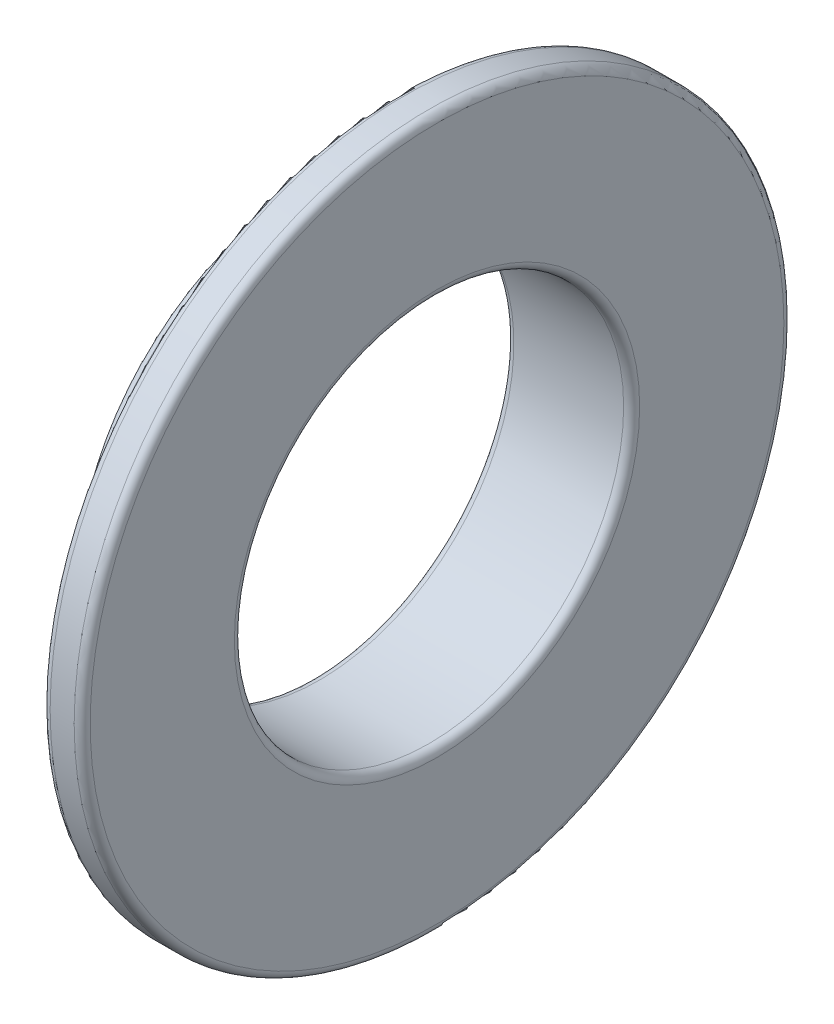
ISO-10303-21;
HEADER;
FILE_DESCRIPTION(('STEP AP214'),'2;1');
FILE_NAME('part.step','',(''),(''),'','','');
FILE_SCHEMA(('AUTOMOTIVE_DESIGN { 1 0 10303 214 1 1 1 1 }'));
ENDSEC;
DATA;
#1=APPLICATION_CONTEXT('core data for automotive mechanical design processes');
#2=APPLICATION_PROTOCOL_DEFINITION('international standard','automotive_design',2000,#1);
#3=PRODUCT_CONTEXT('',#1,'mechanical');
#4=PRODUCT('Part','Part','',(#3));
#5=PRODUCT_RELATED_PRODUCT_CATEGORY('part','',(#4));
#6=PRODUCT_DEFINITION_FORMATION('','',#4);
#7=PRODUCT_DEFINITION_CONTEXT('part definition',#1,'design');
#8=PRODUCT_DEFINITION('design','',#6,#7);
#9=PRODUCT_DEFINITION_SHAPE('','',#8);
#10=(LENGTH_UNIT() NAMED_UNIT(*) SI_UNIT(.MILLI.,.METRE.));
#11=(NAMED_UNIT(*) PLANE_ANGLE_UNIT() SI_UNIT($,.RADIAN.));
#12=(NAMED_UNIT(*) SI_UNIT($,.STERADIAN.) SOLID_ANGLE_UNIT());
#13=UNCERTAINTY_MEASURE_WITH_UNIT(LENGTH_MEASURE(1.E-05),#10,'distance_accuracy_value','');
#14=(GEOMETRIC_REPRESENTATION_CONTEXT(3) GLOBAL_UNCERTAINTY_ASSIGNED_CONTEXT((#13)) GLOBAL_UNIT_ASSIGNED_CONTEXT((#10,
#11,#12)) REPRESENTATION_CONTEXT('',''));
#15=CARTESIAN_POINT('',(0.,0.,0.));
#16=DIRECTION('',(0.,0.,1.));
#17=DIRECTION('',(1.,0.,0.));
#18=AXIS2_PLACEMENT_3D('',#15,#16,#17);
#19=CARTESIAN_POINT('',(10.,0.,0.));
#20=DIRECTION('',(-1.,0.,0.));
#21=DIRECTION('',(0.,0.,1.));
#22=AXIS2_PLACEMENT_3D('',#19,#20,#21);
#23=PLANE('',#22);
#24=CARTESIAN_POINT('',(10.,0.,0.));
#25=DIRECTION('',(-1.,0.,0.));
#26=DIRECTION('',(0.,0.,1.));
#27=AXIS2_PLACEMENT_3D('',#24,#25,#26);
#28=CIRCLE('',#27,15.45);
#29=CARTESIAN_POINT('',(10.,0.,15.45));
#30=VERTEX_POINT('',#29);
#31=EDGE_CURVE('E43',#30,#30,#28,.F.);
#32=ORIENTED_EDGE('',*,*,#31,.T.);
#33=EDGE_LOOP('',(#32));
#34=FACE_BOUND('',#33,.T.);
#35=CARTESIAN_POINT('',(10.,0.,0.));
#36=DIRECTION('',(-1.,0.,0.));
#37=DIRECTION('',(0.,0.,1.));
#38=AXIS2_PLACEMENT_3D('',#35,#36,#37);
#39=CIRCLE('',#38,21.65);
#40=CARTESIAN_POINT('',(10.,0.,21.65));
#41=VERTEX_POINT('',#40);
#42=EDGE_CURVE('E47',#41,#41,#39,.T.);
#43=ORIENTED_EDGE('',*,*,#42,.T.);
#44=EDGE_LOOP('',(#43));
#45=FACE_BOUND('',#44,.T.);
#46=ADVANCED_FACE('F32',(#34,#45),#23,.T.);
#47=CARTESIAN_POINT('',(-30.8496386192104,0.,0.));
#48=DIRECTION('',(-1.,0.,0.));
#49=DIRECTION('',(0.,0.,1.));
#50=AXIS2_PLACEMENT_3D('',#47,#48,#49);
#51=CYLINDRICAL_SURFACE('',#50,14.95);
#52=CARTESIAN_POINT('',(5.15000000000001,0.,0.));
#53=DIRECTION('',(-1.,0.,0.));
#54=DIRECTION('',(0.,0.,1.));
#55=AXIS2_PLACEMENT_3D('',#52,#53,#54);
#56=CIRCLE('',#55,14.95);
#57=CARTESIAN_POINT('',(5.15000000000001,0.,14.95));
#58=VERTEX_POINT('',#57);
#59=EDGE_CURVE('E52',#58,#58,#56,.F.);
#60=ORIENTED_EDGE('',*,*,#59,.T.);
#61=EDGE_LOOP('',(#60));
#62=FACE_BOUND('',#61,.T.);
#63=CARTESIAN_POINT('',(9.5,0.,0.));
#64=DIRECTION('',(-1.,0.,0.));
#65=DIRECTION('',(0.,0.,1.));
#66=AXIS2_PLACEMENT_3D('',#63,#64,#65);
#67=CIRCLE('',#66,14.95);
#68=CARTESIAN_POINT('',(9.5,0.,14.95));
#69=VERTEX_POINT('',#68);
#70=EDGE_CURVE('E55',#69,#69,#67,.T.);
#71=ORIENTED_EDGE('',*,*,#70,.T.);
#72=EDGE_LOOP('',(#71));
#73=FACE_BOUND('',#72,.T.);
#74=ADVANCED_FACE('F88',(#62,#73),#51,.T.);
#75=CARTESIAN_POINT('',(4.65,0.,0.));
#76=DIRECTION('',(-1.,0.,0.));
#77=DIRECTION('',(0.,0.,1.));
#78=AXIS2_PLACEMENT_3D('',#75,#76,#77);
#79=PLANE('',#78);
#80=CARTESIAN_POINT('',(4.65,0.,0.));
#81=DIRECTION('',(-1.,0.,0.));
#82=DIRECTION('',(0.,0.,1.));
#83=AXIS2_PLACEMENT_3D('',#80,#81,#82);
#84=CIRCLE('',#83,14.45);
#85=CARTESIAN_POINT('',(4.65,0.,14.45));
#86=VERTEX_POINT('',#85);
#87=EDGE_CURVE('E58',#86,#86,#84,.T.);
#88=ORIENTED_EDGE('',*,*,#87,.T.);
#89=EDGE_LOOP('',(#88));
#90=FACE_BOUND('',#89,.T.);
#91=CARTESIAN_POINT('',(4.65,0.,0.));
#92=DIRECTION('',(-1.,0.,0.));
#93=DIRECTION('',(0.,0.,1.));
#94=AXIS2_PLACEMENT_3D('',#91,#92,#93);
#95=CIRCLE('',#94,12.65);
#96=CARTESIAN_POINT('',(4.65,0.,12.65));
#97=VERTEX_POINT('',#96);
#98=EDGE_CURVE('E61',#97,#97,#95,.F.);
#99=ORIENTED_EDGE('',*,*,#98,.T.);
#100=EDGE_LOOP('',(#99));
#101=FACE_BOUND('',#100,.T.);
#102=ADVANCED_FACE('F94',(#90,#101),#79,.T.);
#103=CARTESIAN_POINT('',(-30.8496386192104,0.,0.));
#104=DIRECTION('',(-1.,0.,0.));
#105=DIRECTION('',(0.,0.,1.));
#106=AXIS2_PLACEMENT_3D('',#103,#104,#105);
#107=CYLINDRICAL_SURFACE('',#106,12.15);
#108=CARTESIAN_POINT('',(12.,0.,0.));
#109=DIRECTION('',(1.,0.,0.));
#110=DIRECTION('',(0.,0.,-1.));
#111=AXIS2_PLACEMENT_3D('',#108,#109,#110);
#112=CIRCLE('',#111,12.15);
#113=CARTESIAN_POINT('',(12.,0.,-12.15));
#114=VERTEX_POINT('',#113);
#115=EDGE_CURVE('E10',#114,#114,#112,.T.);
#116=ORIENTED_EDGE('',*,*,#115,.T.);
#117=EDGE_LOOP('',(#116));
#118=FACE_BOUND('',#117,.T.);
#119=CARTESIAN_POINT('',(5.15000000000001,0.,0.));
#120=DIRECTION('',(-1.,0.,0.));
#121=DIRECTION('',(0.,0.,1.));
#122=AXIS2_PLACEMENT_3D('',#119,#120,#121);
#123=CIRCLE('',#122,12.15);
#124=CARTESIAN_POINT('',(5.15000000000001,0.,12.15));
#125=VERTEX_POINT('',#124);
#126=EDGE_CURVE('E39',#125,#125,#123,.T.);
#127=ORIENTED_EDGE('',*,*,#126,.T.);
#128=EDGE_LOOP('',(#127));
#129=FACE_BOUND('',#128,.T.);
#130=ADVANCED_FACE('F120',(#118,#129),#107,.F.);
#131=CARTESIAN_POINT('',(12.5,0.,0.));
#132=DIRECTION('',(1.,0.,0.));
#133=DIRECTION('',(0.,0.,-1.));
#134=AXIS2_PLACEMENT_3D('',#131,#132,#133);
#135=PLANE('',#134);
#136=CARTESIAN_POINT('',(12.5,0.,0.));
#137=DIRECTION('',(1.,0.,0.));
#138=DIRECTION('',(0.,0.,-1.));
#139=AXIS2_PLACEMENT_3D('',#136,#137,#138);
#140=CIRCLE('',#139,21.65);
#141=CARTESIAN_POINT('',(12.5,0.,-21.65));
#142=VERTEX_POINT('',#141);
#143=EDGE_CURVE('E64',#142,#142,#140,.T.);
#144=ORIENTED_EDGE('',*,*,#143,.T.);
#145=EDGE_LOOP('',(#144));
#146=FACE_BOUND('',#145,.T.);
#147=CARTESIAN_POINT('',(12.5,0.,0.));
#148=DIRECTION('',(1.,0.,0.));
#149=DIRECTION('',(0.,0.,-1.));
#150=AXIS2_PLACEMENT_3D('',#147,#148,#149);
#151=CIRCLE('',#150,12.65);
#152=CARTESIAN_POINT('',(12.5,0.,-12.65));
#153=VERTEX_POINT('',#152);
#154=EDGE_CURVE('E67',#153,#153,#151,.F.);
#155=ORIENTED_EDGE('',*,*,#154,.T.);
#156=EDGE_LOOP('',(#155));
#157=FACE_BOUND('',#156,.T.);
#158=ADVANCED_FACE('F118',(#146,#157),#135,.T.);
#159=CARTESIAN_POINT('',(-30.8496386192104,0.,0.));
#160=DIRECTION('',(-1.,0.,0.));
#161=DIRECTION('',(0.,0.,1.));
#162=AXIS2_PLACEMENT_3D('',#159,#160,#161);
#163=CYLINDRICAL_SURFACE('',#162,22.15);
#164=CARTESIAN_POINT('',(12.,0.,0.));
#165=DIRECTION('',(1.,0.,0.));
#166=DIRECTION('',(0.,0.,-1.));
#167=AXIS2_PLACEMENT_3D('',#164,#165,#166);
#168=CIRCLE('',#167,22.15);
#169=CARTESIAN_POINT('',(12.,0.,-22.15));
#170=VERTEX_POINT('',#169);
#171=EDGE_CURVE('E70',#170,#170,#168,.F.);
#172=ORIENTED_EDGE('',*,*,#171,.T.);
#173=EDGE_LOOP('',(#172));
#174=FACE_BOUND('',#173,.T.);
#175=CARTESIAN_POINT('',(10.5,0.,0.));
#176=DIRECTION('',(-1.,0.,0.));
#177=DIRECTION('',(0.,0.,1.));
#178=AXIS2_PLACEMENT_3D('',#175,#176,#177);
#179=CIRCLE('',#178,22.15);
#180=CARTESIAN_POINT('',(10.5,0.,22.15));
#181=VERTEX_POINT('',#180);
#182=EDGE_CURVE('E73',#181,#181,#179,.F.);
#183=ORIENTED_EDGE('',*,*,#182,.T.);
#184=EDGE_LOOP('',(#183));
#185=FACE_BOUND('',#184,.T.);
#186=ADVANCED_FACE('F77',(#174,#185),#163,.T.);
#187=CARTESIAN_POINT('',(12.,0.,0.));
#188=DIRECTION('',(1.,0.,0.));
#189=DIRECTION('',(0.,0.,-1.));
#190=AXIS2_PLACEMENT_3D('',#187,#188,#189);
#191=TOROIDAL_SURFACE('',#190,21.65,0.5);
#192=ORIENTED_EDGE('',*,*,#143,.F.);
#193=EDGE_LOOP('',(#192));
#194=FACE_BOUND('',#193,.T.);
#195=ORIENTED_EDGE('',*,*,#171,.F.);
#196=EDGE_LOOP('',(#195));
#197=FACE_BOUND('',#196,.T.);
#198=ADVANCED_FACE('F99',(#194,#197),#191,.T.);
#199=CARTESIAN_POINT('',(5.15000000000001,0.,0.));
#200=DIRECTION('',(-1.,0.,0.));
#201=DIRECTION('',(0.,0.,1.));
#202=AXIS2_PLACEMENT_3D('',#199,#200,#201);
#203=TOROIDAL_SURFACE('',#202,14.45,0.5);
#204=ORIENTED_EDGE('',*,*,#59,.F.);
#205=EDGE_LOOP('',(#204));
#206=FACE_BOUND('',#205,.T.);
#207=ORIENTED_EDGE('',*,*,#87,.F.);
#208=EDGE_LOOP('',(#207));
#209=FACE_BOUND('',#208,.T.);
#210=ADVANCED_FACE('F102',(#206,#209),#203,.T.);
#211=CARTESIAN_POINT('',(9.5,0.,0.));
#212=DIRECTION('',(-1.,0.,0.));
#213=DIRECTION('',(0.,0.,1.));
#214=AXIS2_PLACEMENT_3D('',#211,#212,#213);
#215=TOROIDAL_SURFACE('',#214,15.45,0.5);
#216=ORIENTED_EDGE('',*,*,#31,.F.);
#217=EDGE_LOOP('',(#216));
#218=FACE_BOUND('',#217,.T.);
#219=ORIENTED_EDGE('',*,*,#70,.F.);
#220=EDGE_LOOP('',(#219));
#221=FACE_BOUND('',#220,.T.);
#222=ADVANCED_FACE('F83',(#218,#221),#215,.F.);
#223=CARTESIAN_POINT('',(10.5,0.,0.));
#224=DIRECTION('',(-1.,0.,0.));
#225=DIRECTION('',(0.,0.,1.));
#226=AXIS2_PLACEMENT_3D('',#223,#224,#225);
#227=TOROIDAL_SURFACE('',#226,21.65,0.5);
#228=ORIENTED_EDGE('',*,*,#182,.F.);
#229=EDGE_LOOP('',(#228));
#230=FACE_BOUND('',#229,.T.);
#231=ORIENTED_EDGE('',*,*,#42,.F.);
#232=EDGE_LOOP('',(#231));
#233=FACE_BOUND('',#232,.T.);
#234=ADVANCED_FACE('F79',(#230,#233),#227,.T.);
#235=CARTESIAN_POINT('',(12.,0.,0.));
#236=DIRECTION('',(1.,0.,0.));
#237=DIRECTION('',(0.,0.,-1.));
#238=AXIS2_PLACEMENT_3D('',#235,#236,#237);
#239=TOROIDAL_SURFACE('',#238,12.65,0.5);
#240=ORIENTED_EDGE('',*,*,#115,.F.);
#241=EDGE_LOOP('',(#240));
#242=FACE_BOUND('',#241,.T.);
#243=ORIENTED_EDGE('',*,*,#154,.F.);
#244=EDGE_LOOP('',(#243));
#245=FACE_BOUND('',#244,.T.);
#246=ADVANCED_FACE('F82',(#242,#245),#239,.T.);
#247=CARTESIAN_POINT('',(5.15000000000001,0.,0.));
#248=DIRECTION('',(-1.,0.,0.));
#249=DIRECTION('',(0.,0.,1.));
#250=AXIS2_PLACEMENT_3D('',#247,#248,#249);
#251=TOROIDAL_SURFACE('',#250,12.65,0.5);
#252=ORIENTED_EDGE('',*,*,#98,.F.);
#253=EDGE_LOOP('',(#252));
#254=FACE_BOUND('',#253,.T.);
#255=ORIENTED_EDGE('',*,*,#126,.F.);
#256=EDGE_LOOP('',(#255));
#257=FACE_BOUND('',#256,.T.);
#258=ADVANCED_FACE('F34',(#254,#257),#251,.T.);
#259=CLOSED_SHELL('',(#46,#74,#102,#130,#158,#186,#198,#210,#222,#234,#246,#258));
#260=MANIFOLD_SOLID_BREP('B2',#259);
#261=ADVANCED_BREP_SHAPE_REPRESENTATION('',(#18,#260),#14);
#262=SHAPE_DEFINITION_REPRESENTATION(#9,#261);
ENDSEC;
END-ISO-10303-21;
